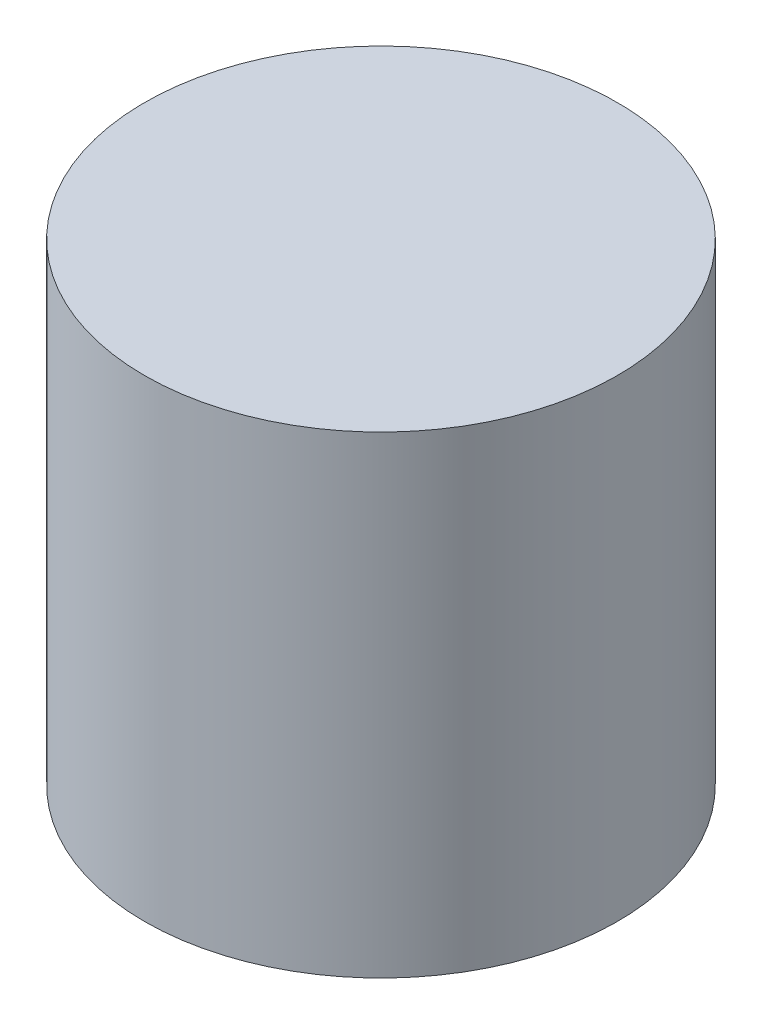
ISO-10303-21;
HEADER;
FILE_DESCRIPTION(('STEP AP214'),'2;1');
FILE_NAME('part.step','',(''),(''),'','','');
FILE_SCHEMA(('AUTOMOTIVE_DESIGN { 1 0 10303 214 1 1 1 1 }'));
ENDSEC;
DATA;
#1=APPLICATION_CONTEXT('core data for automotive mechanical design processes');
#2=APPLICATION_PROTOCOL_DEFINITION('international standard','automotive_design',2000,#1);
#3=PRODUCT_CONTEXT('',#1,'mechanical');
#4=PRODUCT('Part','Part','',(#3));
#5=PRODUCT_RELATED_PRODUCT_CATEGORY('part','',(#4));
#6=PRODUCT_DEFINITION_FORMATION('','',#4);
#7=PRODUCT_DEFINITION_CONTEXT('part definition',#1,'design');
#8=PRODUCT_DEFINITION('design','',#6,#7);
#9=PRODUCT_DEFINITION_SHAPE('','',#8);
#10=(LENGTH_UNIT() NAMED_UNIT(*) SI_UNIT(.MILLI.,.METRE.));
#11=(NAMED_UNIT(*) PLANE_ANGLE_UNIT() SI_UNIT($,.RADIAN.));
#12=(NAMED_UNIT(*) SI_UNIT($,.STERADIAN.) SOLID_ANGLE_UNIT());
#13=UNCERTAINTY_MEASURE_WITH_UNIT(LENGTH_MEASURE(1.E-05),#10,'distance_accuracy_value','');
#14=(GEOMETRIC_REPRESENTATION_CONTEXT(3) GLOBAL_UNCERTAINTY_ASSIGNED_CONTEXT((#13)) GLOBAL_UNIT_ASSIGNED_CONTEXT((#10,
#11,#12)) REPRESENTATION_CONTEXT('',''));
#15=CARTESIAN_POINT('',(0.,0.,0.));
#16=DIRECTION('',(0.,0.,1.));
#17=DIRECTION('',(1.,0.,0.));
#18=AXIS2_PLACEMENT_3D('',#15,#16,#17);
#19=CARTESIAN_POINT('',(0.,17.,0.));
#20=DIRECTION('',(0.,-1.,0.));
#21=DIRECTION('',(0.,0.,-1.));
#22=AXIS2_PLACEMENT_3D('',#19,#20,#21);
#23=CYLINDRICAL_SURFACE('',#22,8.5);
#24=CARTESIAN_POINT('',(0.,17.,0.));
#25=DIRECTION('',(0.,1.,0.));
#26=DIRECTION('',(0.,0.,1.));
#27=AXIS2_PLACEMENT_3D('',#24,#25,#26);
#28=CIRCLE('',#27,8.5);
#29=CARTESIAN_POINT('',(0.,17.,8.5));
#30=VERTEX_POINT('',#29);
#31=EDGE_CURVE('E10',#30,#30,#28,.T.);
#32=ORIENTED_EDGE('',*,*,#31,.F.);
#33=EDGE_LOOP('',(#32));
#34=FACE_BOUND('',#33,.T.);
#35=CARTESIAN_POINT('',(0.,0.,0.));
#36=DIRECTION('',(0.,1.,0.));
#37=DIRECTION('',(0.,0.,1.));
#38=AXIS2_PLACEMENT_3D('',#35,#36,#37);
#39=CIRCLE('',#38,8.5);
#40=CARTESIAN_POINT('',(0.,0.,8.5));
#41=VERTEX_POINT('',#40);
#42=EDGE_CURVE('E34',#41,#41,#39,.T.);
#43=ORIENTED_EDGE('',*,*,#42,.T.);
#44=EDGE_LOOP('',(#43));
#45=FACE_BOUND('',#44,.T.);
#46=ADVANCED_FACE('F31',(#34,#45),#23,.T.);
#47=CARTESIAN_POINT('',(0.,17.,0.));
#48=DIRECTION('',(0.,1.,0.));
#49=DIRECTION('',(0.,0.,1.));
#50=AXIS2_PLACEMENT_3D('',#47,#48,#49);
#51=PLANE('',#50);
#52=ORIENTED_EDGE('',*,*,#31,.T.);
#53=EDGE_LOOP('',(#52));
#54=FACE_BOUND('',#53,.T.);
#55=ADVANCED_FACE('F60',(#54),#51,.T.);
#56=CARTESIAN_POINT('',(0.,0.,0.));
#57=DIRECTION('',(0.,1.,0.));
#58=DIRECTION('',(0.,0.,1.));
#59=AXIS2_PLACEMENT_3D('',#56,#57,#58);
#60=PLANE('',#59);
#61=CARTESIAN_POINT('',(0.,0.,0.));
#62=DIRECTION('',(0.,-1.,0.));
#63=DIRECTION('',(0.,0.,-1.));
#64=AXIS2_PLACEMENT_3D('',#61,#62,#63);
#65=CIRCLE('',#64,3.);
#66=CARTESIAN_POINT('',(0.,0.,-3.));
#67=VERTEX_POINT('',#66);
#68=EDGE_CURVE('E43',#67,#67,#65,.T.);
#69=ORIENTED_EDGE('',*,*,#68,.F.);
#70=EDGE_LOOP('',(#69));
#71=FACE_BOUND('',#70,.T.);
#72=ORIENTED_EDGE('',*,*,#42,.F.);
#73=EDGE_LOOP('',(#72));
#74=FACE_BOUND('',#73,.T.);
#75=ADVANCED_FACE('F54',(#71,#74),#60,.F.);
#76=CARTESIAN_POINT('',(0.,10.,0.));
#77=DIRECTION('',(0.,-1.,0.));
#78=DIRECTION('',(0.,0.,-1.));
#79=AXIS2_PLACEMENT_3D('',#76,#77,#78);
#80=CYLINDRICAL_SURFACE('',#79,3.);
#81=CARTESIAN_POINT('',(0.,10.,0.));
#82=DIRECTION('',(0.,-1.,0.));
#83=DIRECTION('',(0.,0.,-1.));
#84=AXIS2_PLACEMENT_3D('',#81,#82,#83);
#85=CIRCLE('',#84,3.);
#86=CARTESIAN_POINT('',(0.,10.,-3.));
#87=VERTEX_POINT('',#86);
#88=EDGE_CURVE('E41',#87,#87,#85,.T.);
#89=ORIENTED_EDGE('',*,*,#88,.F.);
#90=EDGE_LOOP('',(#89));
#91=FACE_BOUND('',#90,.T.);
#92=ORIENTED_EDGE('',*,*,#68,.T.);
#93=EDGE_LOOP('',(#92));
#94=FACE_BOUND('',#93,.T.);
#95=ADVANCED_FACE('F51',(#91,#94),#80,.F.);
#96=CARTESIAN_POINT('',(0.,10.,0.));
#97=DIRECTION('',(0.,-1.,0.));
#98=DIRECTION('',(0.,0.,-1.));
#99=AXIS2_PLACEMENT_3D('',#96,#97,#98);
#100=PLANE('',#99);
#101=ORIENTED_EDGE('',*,*,#88,.T.);
#102=EDGE_LOOP('',(#101));
#103=FACE_BOUND('',#102,.T.);
#104=ADVANCED_FACE('F49',(#103),#100,.T.);
#105=CLOSED_SHELL('',(#46,#55,#75,#95,#104));
#106=MANIFOLD_SOLID_BREP('B2',#105);
#107=ADVANCED_BREP_SHAPE_REPRESENTATION('',(#18,#106),#14);
#108=SHAPE_DEFINITION_REPRESENTATION(#9,#107);
ENDSEC;
END-ISO-10303-21;
